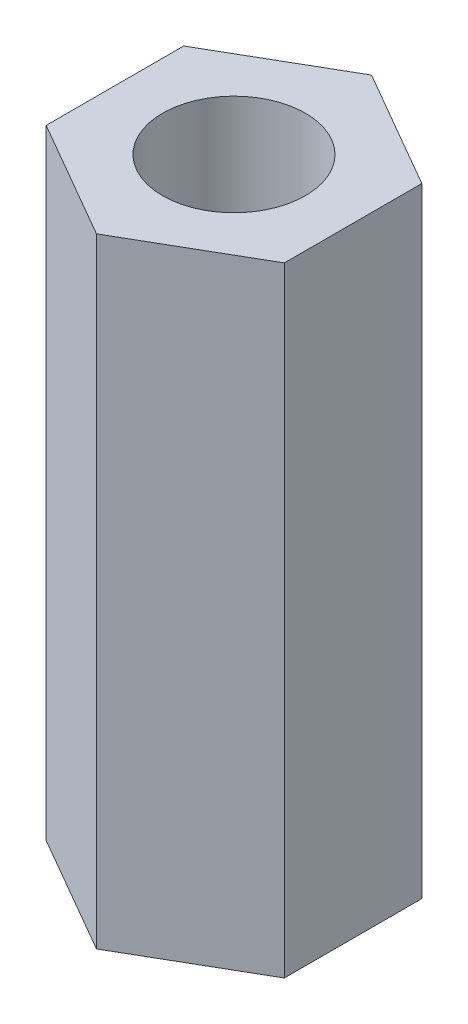
ISO-10303-21;
HEADER;
FILE_DESCRIPTION(('STEP AP214'),'2;1');
FILE_NAME('part.step','',(''),(''),'','','');
FILE_SCHEMA(('AUTOMOTIVE_DESIGN { 1 0 10303 214 1 1 1 1 }'));
ENDSEC;
DATA;
#1=APPLICATION_CONTEXT('core data for automotive mechanical design processes');
#2=APPLICATION_PROTOCOL_DEFINITION('international standard','automotive_design',2000,#1);
#3=PRODUCT_CONTEXT('',#1,'mechanical');
#4=PRODUCT('Part','Part','',(#3));
#5=PRODUCT_RELATED_PRODUCT_CATEGORY('part','',(#4));
#6=PRODUCT_DEFINITION_FORMATION('','',#4);
#7=PRODUCT_DEFINITION_CONTEXT('part definition',#1,'design');
#8=PRODUCT_DEFINITION('design','',#6,#7);
#9=PRODUCT_DEFINITION_SHAPE('','',#8);
#10=(LENGTH_UNIT() NAMED_UNIT(*) SI_UNIT(.MILLI.,.METRE.));
#11=(NAMED_UNIT(*) PLANE_ANGLE_UNIT() SI_UNIT($,.RADIAN.));
#12=(NAMED_UNIT(*) SI_UNIT($,.STERADIAN.) SOLID_ANGLE_UNIT());
#13=UNCERTAINTY_MEASURE_WITH_UNIT(LENGTH_MEASURE(1.E-05),#10,'distance_accuracy_value','');
#14=(GEOMETRIC_REPRESENTATION_CONTEXT(3) GLOBAL_UNCERTAINTY_ASSIGNED_CONTEXT((#13)) GLOBAL_UNIT_ASSIGNED_CONTEXT((#10,
#11,#12)) REPRESENTATION_CONTEXT('',''));
#15=CARTESIAN_POINT('',(0.,0.,0.));
#16=DIRECTION('',(0.,0.,1.));
#17=DIRECTION('',(1.,0.,0.));
#18=AXIS2_PLACEMENT_3D('',#15,#16,#17);
#19=CARTESIAN_POINT('',(2.49999999999998,13.,-1.44337567297407));
#20=DIRECTION('',(-0.5,0.,0.866025403784438));
#21=DIRECTION('',(0.866025403784439,0.,0.5));
#22=AXIS2_PLACEMENT_3D('',#19,#20,#21);
#23=PLANE('',#22);
#24=DIRECTION('',(-0.866025403784439,0.,-0.5));
#25=VECTOR('',#24,1.);
#26=CARTESIAN_POINT('',(2.49999999999998,0.,-1.44337567297407));
#27=LINE('',#26,#25);
#28=CARTESIAN_POINT('',(2.49999999999998,0.,-1.44337567297407));
#29=VERTEX_POINT('',#28);
#30=CARTESIAN_POINT('',(0.,0.,-2.88675134594812));
#31=VERTEX_POINT('',#30);
#32=EDGE_CURVE('E117',#29,#31,#27,.T.);
#33=ORIENTED_EDGE('',*,*,#32,.T.);
#34=DIRECTION('',(0.,-1.,0.));
#35=VECTOR('',#34,1.);
#36=CARTESIAN_POINT('',(0.,13.,-2.88675134594812));
#37=LINE('',#36,#35);
#38=CARTESIAN_POINT('',(0.,13.,-2.88675134594812));
#39=VERTEX_POINT('',#38);
#40=EDGE_CURVE('E11',#39,#31,#37,.T.);
#41=ORIENTED_EDGE('',*,*,#40,.F.);
#42=DIRECTION('',(-0.866025403784439,0.,-0.5));
#43=VECTOR('',#42,1.);
#44=CARTESIAN_POINT('',(2.49999999999998,13.,-1.44337567297407));
#45=LINE('',#44,#43);
#46=CARTESIAN_POINT('',(2.49999999999998,13.,-1.44337567297407));
#47=VERTEX_POINT('',#46);
#48=EDGE_CURVE('E128',#47,#39,#45,.T.);
#49=ORIENTED_EDGE('',*,*,#48,.F.);
#50=DIRECTION('',(0.,-1.,0.));
#51=VECTOR('',#50,1.);
#52=CARTESIAN_POINT('',(2.49999999999998,13.,-1.44337567297407));
#53=LINE('',#52,#51);
#54=EDGE_CURVE('E113',#47,#29,#53,.T.);
#55=ORIENTED_EDGE('',*,*,#54,.T.);
#56=EDGE_LOOP('',(#33,#41,#49,#55));
#57=FACE_BOUND('',#56,.T.);
#58=ADVANCED_FACE('F33',(#57),#23,.F.);
#59=CARTESIAN_POINT('',(0.,13.,-2.88675134594812));
#60=DIRECTION('',(0.499999999999999,0.,0.866025403784439));
#61=DIRECTION('',(0.866025403784439,0.,-0.499999999999999));
#62=AXIS2_PLACEMENT_3D('',#59,#60,#61);
#63=PLANE('',#62);
#64=DIRECTION('',(-0.866025403784439,0.,0.499999999999999));
#65=VECTOR('',#64,1.);
#66=CARTESIAN_POINT('',(0.,0.,-2.88675134594812));
#67=LINE('',#66,#65);
#68=CARTESIAN_POINT('',(-2.5,0.,-1.44337567297407));
#69=VERTEX_POINT('',#68);
#70=EDGE_CURVE('E120',#31,#69,#67,.T.);
#71=ORIENTED_EDGE('',*,*,#70,.T.);
#72=DIRECTION('',(0.,-1.,0.));
#73=VECTOR('',#72,1.);
#74=CARTESIAN_POINT('',(-2.5,13.,-1.44337567297407));
#75=LINE('',#74,#73);
#76=CARTESIAN_POINT('',(-2.5,13.,-1.44337567297407));
#77=VERTEX_POINT('',#76);
#78=EDGE_CURVE('E41',#77,#69,#75,.T.);
#79=ORIENTED_EDGE('',*,*,#78,.F.);
#80=DIRECTION('',(-0.866025403784439,0.,0.499999999999999));
#81=VECTOR('',#80,1.);
#82=CARTESIAN_POINT('',(0.,13.,-2.88675134594812));
#83=LINE('',#82,#81);
#84=EDGE_CURVE('E86',#39,#77,#83,.T.);
#85=ORIENTED_EDGE('',*,*,#84,.F.);
#86=ORIENTED_EDGE('',*,*,#40,.T.);
#87=EDGE_LOOP('',(#71,#79,#85,#86));
#88=FACE_BOUND('',#87,.T.);
#89=ADVANCED_FACE('F153',(#88),#63,.F.);
#90=CARTESIAN_POINT('',(-2.5,13.,-1.44337567297407));
#91=DIRECTION('',(1.,0.,0.));
#92=DIRECTION('',(0.,0.,-1.));
#93=AXIS2_PLACEMENT_3D('',#90,#91,#92);
#94=PLANE('',#93);
#95=DIRECTION('',(0.,0.,1.));
#96=VECTOR('',#95,1.);
#97=CARTESIAN_POINT('',(-2.5,0.,-1.44337567297407));
#98=LINE('',#97,#96);
#99=CARTESIAN_POINT('',(-2.5,0.,1.44337567297407));
#100=VERTEX_POINT('',#99);
#101=EDGE_CURVE('E123',#69,#100,#98,.T.);
#102=ORIENTED_EDGE('',*,*,#101,.T.);
#103=DIRECTION('',(0.,-1.,0.));
#104=VECTOR('',#103,1.);
#105=CARTESIAN_POINT('',(-2.5,13.,1.44337567297407));
#106=LINE('',#105,#104);
#107=CARTESIAN_POINT('',(-2.5,13.,1.44337567297407));
#108=VERTEX_POINT('',#107);
#109=EDGE_CURVE('E108',#108,#100,#106,.T.);
#110=ORIENTED_EDGE('',*,*,#109,.F.);
#111=DIRECTION('',(0.,0.,1.));
#112=VECTOR('',#111,1.);
#113=CARTESIAN_POINT('',(-2.5,13.,-1.44337567297407));
#114=LINE('',#113,#112);
#115=EDGE_CURVE('E99',#77,#108,#114,.T.);
#116=ORIENTED_EDGE('',*,*,#115,.F.);
#117=ORIENTED_EDGE('',*,*,#78,.T.);
#118=EDGE_LOOP('',(#102,#110,#116,#117));
#119=FACE_BOUND('',#118,.T.);
#120=ADVANCED_FACE('F134',(#119),#94,.F.);
#121=CARTESIAN_POINT('',(-2.5,13.,1.44337567297407));
#122=DIRECTION('',(0.499999999999999,0.,-0.866025403784439));
#123=DIRECTION('',(-0.866025403784439,0.,-0.499999999999999));
#124=AXIS2_PLACEMENT_3D('',#121,#122,#123);
#125=PLANE('',#124);
#126=DIRECTION('',(0.866025403784439,0.,0.499999999999999));
#127=VECTOR('',#126,1.);
#128=CARTESIAN_POINT('',(-2.5,0.,1.44337567297407));
#129=LINE('',#128,#127);
#130=CARTESIAN_POINT('',(0.,0.,2.88675134594812));
#131=VERTEX_POINT('',#130);
#132=EDGE_CURVE('E107',#100,#131,#129,.T.);
#133=ORIENTED_EDGE('',*,*,#132,.T.);
#134=DIRECTION('',(0.,-1.,0.));
#135=VECTOR('',#134,1.);
#136=CARTESIAN_POINT('',(0.,13.,2.88675134594812));
#137=LINE('',#136,#135);
#138=CARTESIAN_POINT('',(0.,13.,2.88675134594812));
#139=VERTEX_POINT('',#138);
#140=EDGE_CURVE('E104',#139,#131,#137,.T.);
#141=ORIENTED_EDGE('',*,*,#140,.F.);
#142=DIRECTION('',(0.866025403784439,0.,0.499999999999999));
#143=VECTOR('',#142,1.);
#144=CARTESIAN_POINT('',(-2.5,13.,1.44337567297407));
#145=LINE('',#144,#143);
#146=EDGE_CURVE('E93',#108,#139,#145,.T.);
#147=ORIENTED_EDGE('',*,*,#146,.F.);
#148=ORIENTED_EDGE('',*,*,#109,.T.);
#149=EDGE_LOOP('',(#133,#141,#147,#148));
#150=FACE_BOUND('',#149,.T.);
#151=ADVANCED_FACE('F105',(#150),#125,.F.);
#152=CARTESIAN_POINT('',(0.,13.,2.88675134594812));
#153=DIRECTION('',(-0.500000000000001,0.,-0.866025403784438));
#154=DIRECTION('',(-0.866025403784438,0.,0.500000000000001));
#155=AXIS2_PLACEMENT_3D('',#152,#153,#154);
#156=PLANE('',#155);
#157=DIRECTION('',(0.866025403784438,0.,-0.500000000000001));
#158=VECTOR('',#157,1.);
#159=CARTESIAN_POINT('',(0.,0.,2.88675134594812));
#160=LINE('',#159,#158);
#161=CARTESIAN_POINT('',(2.49999999999999,0.,1.44337567297407));
#162=VERTEX_POINT('',#161);
#163=EDGE_CURVE('E72',#131,#162,#160,.T.);
#164=ORIENTED_EDGE('',*,*,#163,.T.);
#165=DIRECTION('',(0.,-1.,0.));
#166=VECTOR('',#165,1.);
#167=CARTESIAN_POINT('',(2.49999999999999,13.,1.44337567297407));
#168=LINE('',#167,#166);
#169=CARTESIAN_POINT('',(2.49999999999999,13.,1.44337567297407));
#170=VERTEX_POINT('',#169);
#171=EDGE_CURVE('E109',#170,#162,#168,.T.);
#172=ORIENTED_EDGE('',*,*,#171,.F.);
#173=DIRECTION('',(0.866025403784438,0.,-0.500000000000001));
#174=VECTOR('',#173,1.);
#175=CARTESIAN_POINT('',(0.,13.,2.88675134594812));
#176=LINE('',#175,#174);
#177=EDGE_CURVE('E97',#139,#170,#176,.T.);
#178=ORIENTED_EDGE('',*,*,#177,.F.);
#179=ORIENTED_EDGE('',*,*,#140,.T.);
#180=EDGE_LOOP('',(#164,#172,#178,#179));
#181=FACE_BOUND('',#180,.T.);
#182=ADVANCED_FACE('F111',(#181),#156,.F.);
#183=CARTESIAN_POINT('',(2.49999999999999,13.,1.44337567297407));
#184=DIRECTION('',(-1.,0.,0.));
#185=DIRECTION('',(0.,0.,1.));
#186=AXIS2_PLACEMENT_3D('',#183,#184,#185);
#187=PLANE('',#186);
#188=DIRECTION('',(0.,0.,-1.));
#189=VECTOR('',#188,1.);
#190=CARTESIAN_POINT('',(2.49999999999999,0.,1.44337567297407));
#191=LINE('',#190,#189);
#192=EDGE_CURVE('E78',#162,#29,#191,.T.);
#193=ORIENTED_EDGE('',*,*,#192,.T.);
#194=ORIENTED_EDGE('',*,*,#54,.F.);
#195=DIRECTION('',(0.,0.,-1.));
#196=VECTOR('',#195,1.);
#197=CARTESIAN_POINT('',(2.49999999999999,13.,1.44337567297407));
#198=LINE('',#197,#196);
#199=EDGE_CURVE('E49',#170,#47,#198,.T.);
#200=ORIENTED_EDGE('',*,*,#199,.F.);
#201=ORIENTED_EDGE('',*,*,#171,.T.);
#202=EDGE_LOOP('',(#193,#194,#200,#201));
#203=FACE_BOUND('',#202,.T.);
#204=ADVANCED_FACE('F141',(#203),#187,.F.);
#205=CARTESIAN_POINT('',(0.,13.,-2.88675134594812));
#206=DIRECTION('',(0.,1.,0.));
#207=DIRECTION('',(0.,0.,1.));
#208=AXIS2_PLACEMENT_3D('',#205,#206,#207);
#209=PLANE('',#208);
#210=CARTESIAN_POINT('',(0.,13.,0.));
#211=DIRECTION('',(0.,1.,0.));
#212=DIRECTION('',(0.,0.,1.));
#213=AXIS2_PLACEMENT_3D('',#210,#211,#212);
#214=CIRCLE('',#213,1.5);
#215=CARTESIAN_POINT('',(0.,13.,1.5));
#216=VERTEX_POINT('',#215);
#217=EDGE_CURVE('E206',#216,#216,#214,.T.);
#218=ORIENTED_EDGE('',*,*,#217,.F.);
#219=EDGE_LOOP('',(#218));
#220=FACE_BOUND('',#219,.T.);
#221=ORIENTED_EDGE('',*,*,#48,.T.);
#222=ORIENTED_EDGE('',*,*,#84,.T.);
#223=ORIENTED_EDGE('',*,*,#115,.T.);
#224=ORIENTED_EDGE('',*,*,#146,.T.);
#225=ORIENTED_EDGE('',*,*,#177,.T.);
#226=ORIENTED_EDGE('',*,*,#199,.T.);
#227=EDGE_LOOP('',(#221,#222,#223,#224,#225,#226));
#228=FACE_BOUND('',#227,.T.);
#229=ADVANCED_FACE('F95',(#220,#228),#209,.T.);
#230=CARTESIAN_POINT('',(0.,0.,-2.88675134594812));
#231=DIRECTION('',(0.,1.,0.));
#232=DIRECTION('',(0.,0.,1.));
#233=AXIS2_PLACEMENT_3D('',#230,#231,#232);
#234=PLANE('',#233);
#235=CARTESIAN_POINT('',(0.,0.,0.));
#236=DIRECTION('',(0.,1.,0.));
#237=DIRECTION('',(0.,0.,1.));
#238=AXIS2_PLACEMENT_3D('',#235,#236,#237);
#239=CIRCLE('',#238,1.5);
#240=CARTESIAN_POINT('',(0.,0.,1.5));
#241=VERTEX_POINT('',#240);
#242=EDGE_CURVE('E121',#241,#241,#239,.F.);
#243=ORIENTED_EDGE('',*,*,#242,.F.);
#244=EDGE_LOOP('',(#243));
#245=FACE_BOUND('',#244,.T.);
#246=ORIENTED_EDGE('',*,*,#32,.F.);
#247=ORIENTED_EDGE('',*,*,#192,.F.);
#248=ORIENTED_EDGE('',*,*,#163,.F.);
#249=ORIENTED_EDGE('',*,*,#132,.F.);
#250=ORIENTED_EDGE('',*,*,#101,.F.);
#251=ORIENTED_EDGE('',*,*,#70,.F.);
#252=EDGE_LOOP('',(#246,#247,#248,#249,#250,#251));
#253=FACE_BOUND('',#252,.T.);
#254=ADVANCED_FACE('F137',(#245,#253),#234,.F.);
#255=CARTESIAN_POINT('',(0.,-0.000999999999999265,0.));
#256=DIRECTION('',(0.,1.,0.));
#257=DIRECTION('',(0.,0.,1.));
#258=AXIS2_PLACEMENT_3D('',#255,#256,#257);
#259=CYLINDRICAL_SURFACE('',#258,1.5);
#260=ORIENTED_EDGE('',*,*,#217,.T.);
#261=EDGE_LOOP('',(#260));
#262=FACE_BOUND('',#261,.T.);
#263=ORIENTED_EDGE('',*,*,#242,.T.);
#264=EDGE_LOOP('',(#263));
#265=FACE_BOUND('',#264,.T.);
#266=ADVANCED_FACE('F190',(#262,#265),#259,.F.);
#267=CLOSED_SHELL('',(#58,#89,#120,#151,#182,#204,#229,#254,#266));
#268=MANIFOLD_SOLID_BREP('B2',#267);
#269=ADVANCED_BREP_SHAPE_REPRESENTATION('',(#18,#268),#14);
#270=SHAPE_DEFINITION_REPRESENTATION(#9,#269);
ENDSEC;
END-ISO-10303-21;
